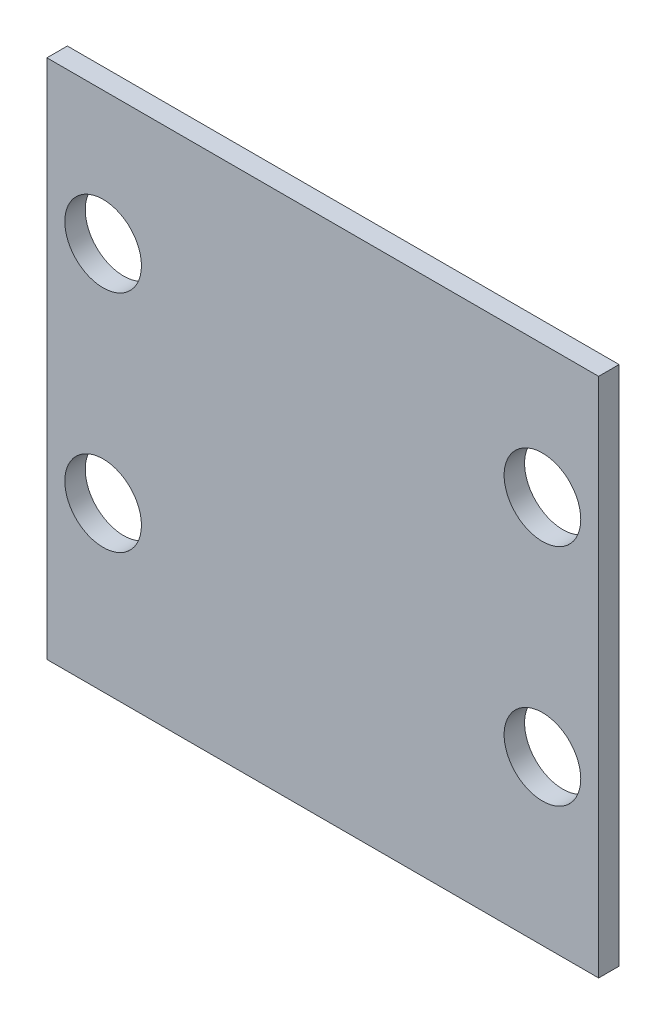
ISO-10303-21;
HEADER;
FILE_DESCRIPTION(('STEP AP214'),'2;1');
FILE_NAME('part.step','',(''),(''),'','','');
FILE_SCHEMA(('AUTOMOTIVE_DESIGN { 1 0 10303 214 1 1 1 1 }'));
ENDSEC;
DATA;
#1=APPLICATION_CONTEXT('core data for automotive mechanical design processes');
#2=APPLICATION_PROTOCOL_DEFINITION('international standard','automotive_design',2000,#1);
#3=PRODUCT_CONTEXT('',#1,'mechanical');
#4=PRODUCT('Part','Part','',(#3));
#5=PRODUCT_RELATED_PRODUCT_CATEGORY('part','',(#4));
#6=PRODUCT_DEFINITION_FORMATION('','',#4);
#7=PRODUCT_DEFINITION_CONTEXT('part definition',#1,'design');
#8=PRODUCT_DEFINITION('design','',#6,#7);
#9=PRODUCT_DEFINITION_SHAPE('','',#8);
#10=(LENGTH_UNIT() NAMED_UNIT(*) SI_UNIT(.MILLI.,.METRE.));
#11=(NAMED_UNIT(*) PLANE_ANGLE_UNIT() SI_UNIT($,.RADIAN.));
#12=(NAMED_UNIT(*) SI_UNIT($,.STERADIAN.) SOLID_ANGLE_UNIT());
#13=UNCERTAINTY_MEASURE_WITH_UNIT(LENGTH_MEASURE(1.E-05),#10,'distance_accuracy_value','');
#14=(GEOMETRIC_REPRESENTATION_CONTEXT(3) GLOBAL_UNCERTAINTY_ASSIGNED_CONTEXT((#13)) GLOBAL_UNIT_ASSIGNED_CONTEXT((#10,
#11,#12)) REPRESENTATION_CONTEXT('',''));
#15=CARTESIAN_POINT('',(0.,0.,0.));
#16=DIRECTION('',(0.,0.,1.));
#17=DIRECTION('',(1.,0.,0.));
#18=AXIS2_PLACEMENT_3D('',#15,#16,#17);
#19=CARTESIAN_POINT('',(27.,25.5,-2.));
#20=DIRECTION('',(1.,0.,0.));
#21=DIRECTION('',(0.,1.,0.));
#22=AXIS2_PLACEMENT_3D('',#19,#20,#21);
#23=PLANE('',#22);
#24=DIRECTION('',(0.,1.,0.));
#25=VECTOR('',#24,1.);
#26=CARTESIAN_POINT('',(27.,25.5,0.));
#27=LINE('',#26,#25);
#28=CARTESIAN_POINT('',(27.,-25.5,0.));
#29=VERTEX_POINT('',#28);
#30=CARTESIAN_POINT('',(27.,25.5,0.));
#31=VERTEX_POINT('',#30);
#32=EDGE_CURVE('E97',#29,#31,#27,.T.);
#33=ORIENTED_EDGE('',*,*,#32,.F.);
#34=DIRECTION('',(0.,0.,1.));
#35=VECTOR('',#34,1.);
#36=CARTESIAN_POINT('',(27.,-25.5,-2.));
#37=LINE('',#36,#35);
#38=CARTESIAN_POINT('',(27.,-25.5,-2.));
#39=VERTEX_POINT('',#38);
#40=EDGE_CURVE('E11',#39,#29,#37,.T.);
#41=ORIENTED_EDGE('',*,*,#40,.F.);
#42=DIRECTION('',(0.,1.,0.));
#43=VECTOR('',#42,1.);
#44=CARTESIAN_POINT('',(27.,25.5,-2.));
#45=LINE('',#44,#43);
#46=CARTESIAN_POINT('',(27.,25.5,-2.));
#47=VERTEX_POINT('',#46);
#48=EDGE_CURVE('E90',#39,#47,#45,.T.);
#49=ORIENTED_EDGE('',*,*,#48,.T.);
#50=DIRECTION('',(0.,0.,1.));
#51=VECTOR('',#50,1.);
#52=CARTESIAN_POINT('',(27.,25.5,-2.));
#53=LINE('',#52,#51);
#54=EDGE_CURVE('E35',#47,#31,#53,.T.);
#55=ORIENTED_EDGE('',*,*,#54,.T.);
#56=EDGE_LOOP('',(#33,#41,#49,#55));
#57=FACE_BOUND('',#56,.T.);
#58=ADVANCED_FACE('F32',(#57),#23,.T.);
#59=CARTESIAN_POINT('',(-27.,-25.5,-2.));
#60=DIRECTION('',(0.,-1.,0.));
#61=DIRECTION('',(0.,0.,-1.));
#62=AXIS2_PLACEMENT_3D('',#59,#60,#61);
#63=PLANE('',#62);
#64=DIRECTION('',(1.,0.,0.));
#65=VECTOR('',#64,1.);
#66=CARTESIAN_POINT('',(-27.,-25.5,0.));
#67=LINE('',#66,#65);
#68=CARTESIAN_POINT('',(-27.,-25.5,0.));
#69=VERTEX_POINT('',#68);
#70=EDGE_CURVE('E92',#69,#29,#67,.T.);
#71=ORIENTED_EDGE('',*,*,#70,.F.);
#72=DIRECTION('',(0.,0.,1.));
#73=VECTOR('',#72,1.);
#74=CARTESIAN_POINT('',(-27.,-25.5,-2.));
#75=LINE('',#74,#73);
#76=CARTESIAN_POINT('',(-27.,-25.5,-2.));
#77=VERTEX_POINT('',#76);
#78=EDGE_CURVE('E41',#77,#69,#75,.T.);
#79=ORIENTED_EDGE('',*,*,#78,.F.);
#80=DIRECTION('',(1.,0.,0.));
#81=VECTOR('',#80,1.);
#82=CARTESIAN_POINT('',(-27.,-25.5,-2.));
#83=LINE('',#82,#81);
#84=EDGE_CURVE('E87',#77,#39,#83,.T.);
#85=ORIENTED_EDGE('',*,*,#84,.T.);
#86=ORIENTED_EDGE('',*,*,#40,.T.);
#87=EDGE_LOOP('',(#71,#79,#85,#86));
#88=FACE_BOUND('',#87,.T.);
#89=ADVANCED_FACE('F108',(#88),#63,.T.);
#90=CARTESIAN_POINT('',(-27.,25.5,-2.));
#91=DIRECTION('',(-1.,0.,0.));
#92=DIRECTION('',(0.,-1.,0.));
#93=AXIS2_PLACEMENT_3D('',#90,#91,#92);
#94=PLANE('',#93);
#95=DIRECTION('',(0.,-1.,0.));
#96=VECTOR('',#95,1.);
#97=CARTESIAN_POINT('',(-27.,25.5,0.));
#98=LINE('',#97,#96);
#99=CARTESIAN_POINT('',(-27.,25.5,0.));
#100=VERTEX_POINT('',#99);
#101=EDGE_CURVE('E82',#100,#69,#98,.T.);
#102=ORIENTED_EDGE('',*,*,#101,.F.);
#103=DIRECTION('',(0.,0.,1.));
#104=VECTOR('',#103,1.);
#105=CARTESIAN_POINT('',(-27.,25.5,-2.));
#106=LINE('',#105,#104);
#107=CARTESIAN_POINT('',(-27.,25.5,-2.));
#108=VERTEX_POINT('',#107);
#109=EDGE_CURVE('E77',#108,#100,#106,.T.);
#110=ORIENTED_EDGE('',*,*,#109,.F.);
#111=DIRECTION('',(0.,-1.,0.));
#112=VECTOR('',#111,1.);
#113=CARTESIAN_POINT('',(-27.,25.5,-2.));
#114=LINE('',#113,#112);
#115=EDGE_CURVE('E80',#108,#77,#114,.T.);
#116=ORIENTED_EDGE('',*,*,#115,.T.);
#117=ORIENTED_EDGE('',*,*,#78,.T.);
#118=EDGE_LOOP('',(#102,#110,#116,#117));
#119=FACE_BOUND('',#118,.T.);
#120=ADVANCED_FACE('F79',(#119),#94,.T.);
#121=CARTESIAN_POINT('',(-27.,25.5,-2.));
#122=DIRECTION('',(0.,1.,0.));
#123=DIRECTION('',(0.,0.,1.));
#124=AXIS2_PLACEMENT_3D('',#121,#122,#123);
#125=PLANE('',#124);
#126=DIRECTION('',(-1.,0.,0.));
#127=VECTOR('',#126,1.);
#128=CARTESIAN_POINT('',(-27.,25.5,0.));
#129=LINE('',#128,#127);
#130=EDGE_CURVE('E100',#31,#100,#129,.T.);
#131=ORIENTED_EDGE('',*,*,#130,.F.);
#132=ORIENTED_EDGE('',*,*,#54,.F.);
#133=DIRECTION('',(-1.,0.,0.));
#134=VECTOR('',#133,1.);
#135=CARTESIAN_POINT('',(-27.,25.5,-2.));
#136=LINE('',#135,#134);
#137=EDGE_CURVE('E86',#47,#108,#136,.T.);
#138=ORIENTED_EDGE('',*,*,#137,.T.);
#139=ORIENTED_EDGE('',*,*,#109,.T.);
#140=EDGE_LOOP('',(#131,#132,#138,#139));
#141=FACE_BOUND('',#140,.T.);
#142=ADVANCED_FACE('F89',(#141),#125,.T.);
#143=CARTESIAN_POINT('',(0.,0.,-2.));
#144=DIRECTION('',(0.,0.,1.));
#145=DIRECTION('',(1.,0.,0.));
#146=AXIS2_PLACEMENT_3D('',#143,#144,#145);
#147=PLANE('',#146);
#148=CARTESIAN_POINT('',(-21.5,-9.5,-2.));
#149=DIRECTION('',(0.,0.,1.));
#150=DIRECTION('',(1.,0.,0.));
#151=AXIS2_PLACEMENT_3D('',#148,#149,#150);
#152=CIRCLE('',#151,3.75);
#153=CARTESIAN_POINT('',(-17.75,-9.5,-2.));
#154=VERTEX_POINT('',#153);
#155=EDGE_CURVE('E149',#154,#154,#152,.T.);
#156=ORIENTED_EDGE('',*,*,#155,.T.);
#157=EDGE_LOOP('',(#156));
#158=FACE_BOUND('',#157,.T.);
#159=CARTESIAN_POINT('',(21.5,-9.5,-2.));
#160=DIRECTION('',(0.,0.,1.));
#161=DIRECTION('',(1.,0.,0.));
#162=AXIS2_PLACEMENT_3D('',#159,#160,#161);
#163=CIRCLE('',#162,3.75);
#164=CARTESIAN_POINT('',(25.25,-9.5,-2.));
#165=VERTEX_POINT('',#164);
#166=EDGE_CURVE('E157',#165,#165,#163,.T.);
#167=ORIENTED_EDGE('',*,*,#166,.T.);
#168=EDGE_LOOP('',(#167));
#169=FACE_BOUND('',#168,.T.);
#170=CARTESIAN_POINT('',(21.5,12.5,-2.));
#171=DIRECTION('',(0.,0.,1.));
#172=DIRECTION('',(1.,0.,0.));
#173=AXIS2_PLACEMENT_3D('',#170,#171,#172);
#174=CIRCLE('',#173,3.75);
#175=CARTESIAN_POINT('',(25.25,12.5,-2.));
#176=VERTEX_POINT('',#175);
#177=EDGE_CURVE('E163',#176,#176,#174,.T.);
#178=ORIENTED_EDGE('',*,*,#177,.T.);
#179=EDGE_LOOP('',(#178));
#180=FACE_BOUND('',#179,.T.);
#181=CARTESIAN_POINT('',(-21.5,12.5,-2.));
#182=DIRECTION('',(0.,0.,1.));
#183=DIRECTION('',(1.,0.,0.));
#184=AXIS2_PLACEMENT_3D('',#181,#182,#183);
#185=CIRCLE('',#184,3.75);
#186=CARTESIAN_POINT('',(-17.75,12.5,-2.));
#187=VERTEX_POINT('',#186);
#188=EDGE_CURVE('E101',#187,#187,#185,.T.);
#189=ORIENTED_EDGE('',*,*,#188,.T.);
#190=EDGE_LOOP('',(#189));
#191=FACE_BOUND('',#190,.T.);
#192=ORIENTED_EDGE('',*,*,#48,.F.);
#193=ORIENTED_EDGE('',*,*,#84,.F.);
#194=ORIENTED_EDGE('',*,*,#115,.F.);
#195=ORIENTED_EDGE('',*,*,#137,.F.);
#196=EDGE_LOOP('',(#192,#193,#194,#195));
#197=FACE_BOUND('',#196,.T.);
#198=ADVANCED_FACE('F85',(#158,#169,#180,#191,#197),#147,.F.);
#199=CARTESIAN_POINT('',(0.,0.,0.));
#200=DIRECTION('',(0.,0.,1.));
#201=DIRECTION('',(1.,0.,0.));
#202=AXIS2_PLACEMENT_3D('',#199,#200,#201);
#203=PLANE('',#202);
#204=CARTESIAN_POINT('',(-21.5,-9.5,0.));
#205=DIRECTION('',(0.,0.,1.));
#206=DIRECTION('',(1.,0.,0.));
#207=AXIS2_PLACEMENT_3D('',#204,#205,#206);
#208=CIRCLE('',#207,3.75);
#209=CARTESIAN_POINT('',(-17.75,-9.5,0.));
#210=VERTEX_POINT('',#209);
#211=EDGE_CURVE('E152',#210,#210,#208,.T.);
#212=ORIENTED_EDGE('',*,*,#211,.F.);
#213=EDGE_LOOP('',(#212));
#214=FACE_BOUND('',#213,.T.);
#215=CARTESIAN_POINT('',(21.5,-9.5,0.));
#216=DIRECTION('',(0.,0.,1.));
#217=DIRECTION('',(1.,0.,0.));
#218=AXIS2_PLACEMENT_3D('',#215,#216,#217);
#219=CIRCLE('',#218,3.75);
#220=CARTESIAN_POINT('',(25.25,-9.5,0.));
#221=VERTEX_POINT('',#220);
#222=EDGE_CURVE('E154',#221,#221,#219,.T.);
#223=ORIENTED_EDGE('',*,*,#222,.F.);
#224=EDGE_LOOP('',(#223));
#225=FACE_BOUND('',#224,.T.);
#226=CARTESIAN_POINT('',(21.5,12.5,0.));
#227=DIRECTION('',(0.,0.,1.));
#228=DIRECTION('',(1.,0.,0.));
#229=AXIS2_PLACEMENT_3D('',#226,#227,#228);
#230=CIRCLE('',#229,3.75);
#231=CARTESIAN_POINT('',(25.25,12.5,0.));
#232=VERTEX_POINT('',#231);
#233=EDGE_CURVE('E160',#232,#232,#230,.T.);
#234=ORIENTED_EDGE('',*,*,#233,.F.);
#235=EDGE_LOOP('',(#234));
#236=FACE_BOUND('',#235,.T.);
#237=CARTESIAN_POINT('',(-21.5,12.5,0.));
#238=DIRECTION('',(0.,0.,1.));
#239=DIRECTION('',(1.,0.,0.));
#240=AXIS2_PLACEMENT_3D('',#237,#238,#239);
#241=CIRCLE('',#240,3.75);
#242=CARTESIAN_POINT('',(-17.75,12.5,0.));
#243=VERTEX_POINT('',#242);
#244=EDGE_CURVE('E166',#243,#243,#241,.T.);
#245=ORIENTED_EDGE('',*,*,#244,.F.);
#246=EDGE_LOOP('',(#245));
#247=FACE_BOUND('',#246,.T.);
#248=ORIENTED_EDGE('',*,*,#32,.T.);
#249=ORIENTED_EDGE('',*,*,#130,.T.);
#250=ORIENTED_EDGE('',*,*,#101,.T.);
#251=ORIENTED_EDGE('',*,*,#70,.T.);
#252=EDGE_LOOP('',(#248,#249,#250,#251));
#253=FACE_BOUND('',#252,.T.);
#254=ADVANCED_FACE('F107',(#214,#225,#236,#247,#253),#203,.T.);
#255=CARTESIAN_POINT('',(-21.5,12.5,-2.));
#256=DIRECTION('',(0.,0.,1.));
#257=DIRECTION('',(1.,0.,0.));
#258=AXIS2_PLACEMENT_3D('',#255,#256,#257);
#259=CYLINDRICAL_SURFACE('',#258,3.75);
#260=ORIENTED_EDGE('',*,*,#188,.F.);
#261=EDGE_LOOP('',(#260));
#262=FACE_BOUND('',#261,.T.);
#263=ORIENTED_EDGE('',*,*,#244,.T.);
#264=EDGE_LOOP('',(#263));
#265=FACE_BOUND('',#264,.T.);
#266=ADVANCED_FACE('F126',(#262,#265),#259,.F.);
#267=CARTESIAN_POINT('',(21.5,12.5,-2.));
#268=DIRECTION('',(0.,0.,1.));
#269=DIRECTION('',(1.,0.,0.));
#270=AXIS2_PLACEMENT_3D('',#267,#268,#269);
#271=CYLINDRICAL_SURFACE('',#270,3.75);
#272=ORIENTED_EDGE('',*,*,#177,.F.);
#273=EDGE_LOOP('',(#272));
#274=FACE_BOUND('',#273,.T.);
#275=ORIENTED_EDGE('',*,*,#233,.T.);
#276=EDGE_LOOP('',(#275));
#277=FACE_BOUND('',#276,.T.);
#278=ADVANCED_FACE('F133',(#274,#277),#271,.F.);
#279=CARTESIAN_POINT('',(21.5,-9.5,-2.));
#280=DIRECTION('',(0.,0.,1.));
#281=DIRECTION('',(1.,0.,0.));
#282=AXIS2_PLACEMENT_3D('',#279,#280,#281);
#283=CYLINDRICAL_SURFACE('',#282,3.75);
#284=ORIENTED_EDGE('',*,*,#166,.F.);
#285=EDGE_LOOP('',(#284));
#286=FACE_BOUND('',#285,.T.);
#287=ORIENTED_EDGE('',*,*,#222,.T.);
#288=EDGE_LOOP('',(#287));
#289=FACE_BOUND('',#288,.T.);
#290=ADVANCED_FACE('F137',(#286,#289),#283,.F.);
#291=CARTESIAN_POINT('',(-21.5,-9.5,-2.));
#292=DIRECTION('',(0.,0.,1.));
#293=DIRECTION('',(1.,0.,0.));
#294=AXIS2_PLACEMENT_3D('',#291,#292,#293);
#295=CYLINDRICAL_SURFACE('',#294,3.75);
#296=ORIENTED_EDGE('',*,*,#155,.F.);
#297=EDGE_LOOP('',(#296));
#298=FACE_BOUND('',#297,.T.);
#299=ORIENTED_EDGE('',*,*,#211,.T.);
#300=EDGE_LOOP('',(#299));
#301=FACE_BOUND('',#300,.T.);
#302=ADVANCED_FACE('F141',(#298,#301),#295,.F.);
#303=CLOSED_SHELL('',(#58,#89,#120,#142,#198,#254,#266,#278,#290,#302));
#304=MANIFOLD_SOLID_BREP('B2',#303);
#305=ADVANCED_BREP_SHAPE_REPRESENTATION('',(#18,#304),#14);
#306=SHAPE_DEFINITION_REPRESENTATION(#9,#305);
ENDSEC;
END-ISO-10303-21;
